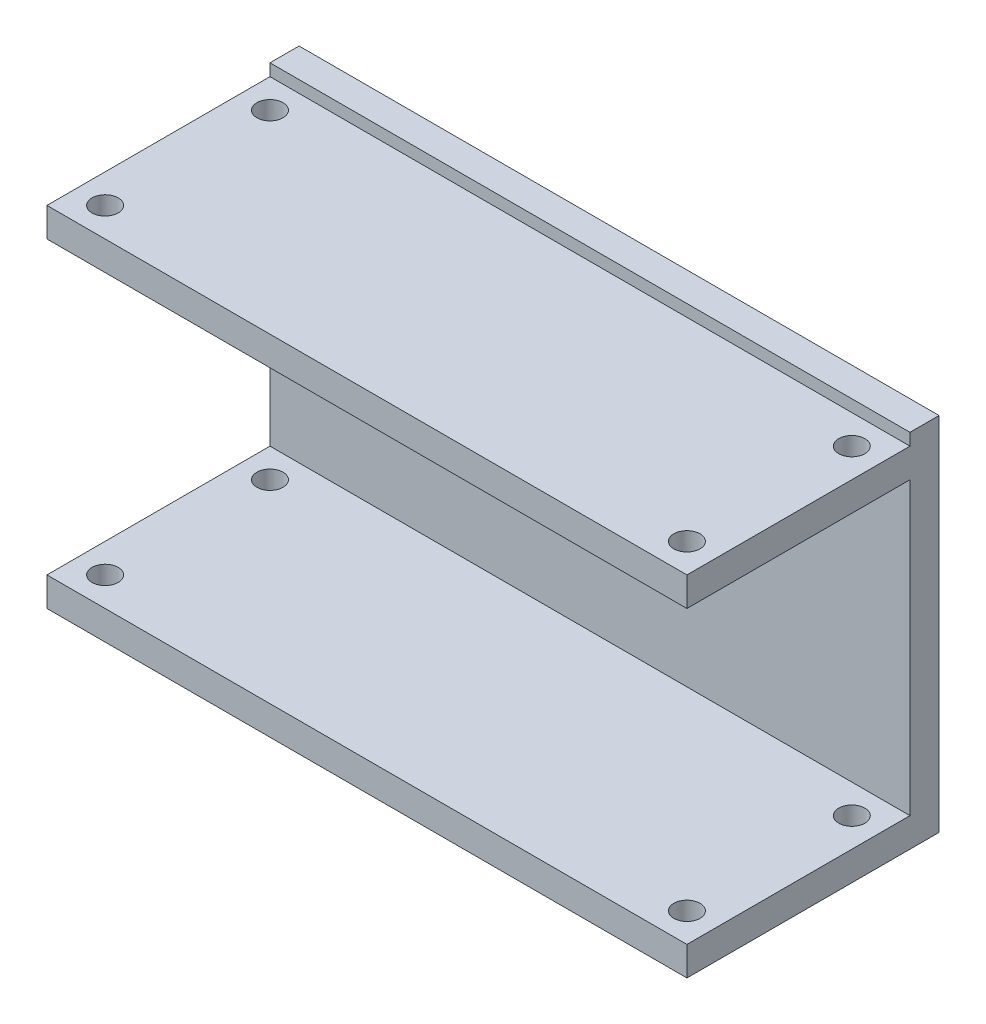
ISO-10303-21;
HEADER;
FILE_DESCRIPTION(('STEP AP214'),'2;1');
FILE_NAME('part.step','',(''),(''),'','','');
FILE_SCHEMA(('AUTOMOTIVE_DESIGN { 1 0 10303 214 1 1 1 1 }'));
ENDSEC;
DATA;
#1=APPLICATION_CONTEXT('core data for automotive mechanical design processes');
#2=APPLICATION_PROTOCOL_DEFINITION('international standard','automotive_design',2000,#1);
#3=PRODUCT_CONTEXT('',#1,'mechanical');
#4=PRODUCT('Part','Part','',(#3));
#5=PRODUCT_RELATED_PRODUCT_CATEGORY('part','',(#4));
#6=PRODUCT_DEFINITION_FORMATION('','',#4);
#7=PRODUCT_DEFINITION_CONTEXT('part definition',#1,'design');
#8=PRODUCT_DEFINITION('design','',#6,#7);
#9=PRODUCT_DEFINITION_SHAPE('','',#8);
#10=(LENGTH_UNIT() NAMED_UNIT(*) SI_UNIT(.MILLI.,.METRE.));
#11=(NAMED_UNIT(*) PLANE_ANGLE_UNIT() SI_UNIT($,.RADIAN.));
#12=(NAMED_UNIT(*) SI_UNIT($,.STERADIAN.) SOLID_ANGLE_UNIT());
#13=UNCERTAINTY_MEASURE_WITH_UNIT(LENGTH_MEASURE(1.E-05),#10,'distance_accuracy_value','');
#14=(GEOMETRIC_REPRESENTATION_CONTEXT(3) GLOBAL_UNCERTAINTY_ASSIGNED_CONTEXT((#13)) GLOBAL_UNIT_ASSIGNED_CONTEXT((#10,
#11,#12)) REPRESENTATION_CONTEXT('',''));
#15=CARTESIAN_POINT('',(0.,0.,0.));
#16=DIRECTION('',(0.,0.,1.));
#17=DIRECTION('',(1.,0.,0.));
#18=AXIS2_PLACEMENT_3D('',#15,#16,#17);
#19=CARTESIAN_POINT('',(0.,0.,-11.5));
#20=DIRECTION('',(0.,0.,1.));
#21=DIRECTION('',(1.,0.,0.));
#22=AXIS2_PLACEMENT_3D('',#19,#20,#21);
#23=PLANE('',#22);
#24=DIRECTION('',(0.,1.,0.));
#25=VECTOR('',#24,1.);
#26=CARTESIAN_POINT('',(-33.,0.,-11.5));
#27=LINE('',#26,#25);
#28=CARTESIAN_POINT('',(-33.,36.,-11.5));
#29=VERTEX_POINT('',#28);
#30=CARTESIAN_POINT('',(-33.,37.2364215365135,-11.5));
#31=VERTEX_POINT('',#30);
#32=EDGE_CURVE('E193',#29,#31,#27,.T.);
#33=ORIENTED_EDGE('',*,*,#32,.F.);
#34=DIRECTION('',(-1.,0.,0.));
#35=VECTOR('',#34,1.);
#36=CARTESIAN_POINT('',(-33.,36.,-11.5));
#37=LINE('',#36,#35);
#38=CARTESIAN_POINT('',(33.,36.,-11.5));
#39=VERTEX_POINT('',#38);
#40=EDGE_CURVE('E148',#39,#29,#37,.T.);
#41=ORIENTED_EDGE('',*,*,#40,.F.);
#42=DIRECTION('',(0.,-1.,0.));
#43=VECTOR('',#42,1.);
#44=CARTESIAN_POINT('',(33.,0.,-11.5));
#45=LINE('',#44,#43);
#46=CARTESIAN_POINT('',(33.,37.2364215365135,-11.5));
#47=VERTEX_POINT('',#46);
#48=EDGE_CURVE('E190',#47,#39,#45,.T.);
#49=ORIENTED_EDGE('',*,*,#48,.F.);
#50=DIRECTION('',(1.,0.,0.));
#51=VECTOR('',#50,1.);
#52=CARTESIAN_POINT('',(33.,37.2364215365135,-11.5));
#53=LINE('',#52,#51);
#54=EDGE_CURVE('E179',#31,#47,#53,.T.);
#55=ORIENTED_EDGE('',*,*,#54,.F.);
#56=EDGE_LOOP('',(#33,#41,#49,#55));
#57=FACE_BOUND('',#56,.T.);
#58=ADVANCED_FACE('F39',(#57),#23,.T.);
#59=CARTESIAN_POINT('',(0.,3.,0.));
#60=DIRECTION('',(0.,1.,0.));
#61=DIRECTION('',(0.,0.,1.));
#62=AXIS2_PLACEMENT_3D('',#59,#60,#61);
#63=PLANE('',#62);
#64=CARTESIAN_POINT('',(-30.,3.,8.5));
#65=DIRECTION('',(0.,1.,0.));
#66=DIRECTION('',(0.,0.,1.));
#67=AXIS2_PLACEMENT_3D('',#64,#65,#66);
#68=CIRCLE('',#67,1.35);
#69=CARTESIAN_POINT('',(-30.,3.,9.85));
#70=VERTEX_POINT('',#69);
#71=EDGE_CURVE('E214',#70,#70,#68,.T.);
#72=ORIENTED_EDGE('',*,*,#71,.F.);
#73=EDGE_LOOP('',(#72));
#74=FACE_BOUND('',#73,.T.);
#75=CARTESIAN_POINT('',(30.,3.,8.5));
#76=DIRECTION('',(0.,1.,0.));
#77=DIRECTION('',(0.,0.,-1.));
#78=AXIS2_PLACEMENT_3D('',#75,#76,#77);
#79=CIRCLE('',#78,1.35000000000001);
#80=CARTESIAN_POINT('',(30.,3.,7.15));
#81=VERTEX_POINT('',#80);
#82=EDGE_CURVE('E230',#81,#81,#79,.T.);
#83=ORIENTED_EDGE('',*,*,#82,.F.);
#84=EDGE_LOOP('',(#83));
#85=FACE_BOUND('',#84,.T.);
#86=DIRECTION('',(0.,0.,-1.));
#87=VECTOR('',#86,1.);
#88=CARTESIAN_POINT('',(33.,3.,-11.5));
#89=LINE('',#88,#87);
#90=CARTESIAN_POINT('',(33.,3.,11.5));
#91=VERTEX_POINT('',#90);
#92=CARTESIAN_POINT('',(33.,3.,-11.5));
#93=VERTEX_POINT('',#92);
#94=EDGE_CURVE('E238',#91,#93,#89,.T.);
#95=ORIENTED_EDGE('',*,*,#94,.T.);
#96=DIRECTION('',(-1.,0.,0.));
#97=VECTOR('',#96,1.);
#98=CARTESIAN_POINT('',(-33.,3.,-11.5));
#99=LINE('',#98,#97);
#100=CARTESIAN_POINT('',(-33.,3.,-11.5));
#101=VERTEX_POINT('',#100);
#102=EDGE_CURVE('E241',#93,#101,#99,.T.);
#103=ORIENTED_EDGE('',*,*,#102,.T.);
#104=DIRECTION('',(0.,0.,1.));
#105=VECTOR('',#104,1.);
#106=CARTESIAN_POINT('',(-33.,3.,-11.5));
#107=LINE('',#106,#105);
#108=CARTESIAN_POINT('',(-33.,3.,11.5));
#109=VERTEX_POINT('',#108);
#110=EDGE_CURVE('E244',#101,#109,#107,.T.);
#111=ORIENTED_EDGE('',*,*,#110,.T.);
#112=DIRECTION('',(1.,0.,0.));
#113=VECTOR('',#112,1.);
#114=CARTESIAN_POINT('',(-33.,3.,11.5));
#115=LINE('',#114,#113);
#116=EDGE_CURVE('E64',#109,#91,#115,.T.);
#117=ORIENTED_EDGE('',*,*,#116,.T.);
#118=EDGE_LOOP('',(#95,#103,#111,#117));
#119=FACE_BOUND('',#118,.T.);
#120=CARTESIAN_POINT('',(30.,3.,-8.5));
#121=DIRECTION('',(0.,1.,0.));
#122=DIRECTION('',(0.,0.,-1.));
#123=AXIS2_PLACEMENT_3D('',#120,#121,#122);
#124=CIRCLE('',#123,1.35000000000001);
#125=CARTESIAN_POINT('',(30.,3.,-9.85));
#126=VERTEX_POINT('',#125);
#127=EDGE_CURVE('E222',#126,#126,#124,.T.);
#128=ORIENTED_EDGE('',*,*,#127,.F.);
#129=EDGE_LOOP('',(#128));
#130=FACE_BOUND('',#129,.T.);
#131=CARTESIAN_POINT('',(-30.,3.,-8.5));
#132=DIRECTION('',(0.,1.,0.));
#133=DIRECTION('',(0.,0.,1.));
#134=AXIS2_PLACEMENT_3D('',#131,#132,#133);
#135=CIRCLE('',#134,1.35);
#136=CARTESIAN_POINT('',(-30.,3.,-7.15));
#137=VERTEX_POINT('',#136);
#138=EDGE_CURVE('E206',#137,#137,#135,.T.);
#139=ORIENTED_EDGE('',*,*,#138,.F.);
#140=EDGE_LOOP('',(#139));
#141=FACE_BOUND('',#140,.T.);
#142=ADVANCED_FACE('F281',(#74,#85,#119,#130,#141),#63,.T.);
#143=CARTESIAN_POINT('',(0.,0.,0.));
#144=DIRECTION('',(0.,1.,0.));
#145=DIRECTION('',(0.,0.,1.));
#146=AXIS2_PLACEMENT_3D('',#143,#144,#145);
#147=PLANE('',#146);
#148=DIRECTION('',(0.,0.,-1.));
#149=VECTOR('',#148,1.);
#150=CARTESIAN_POINT('',(33.,0.,-11.5));
#151=LINE('',#150,#149);
#152=CARTESIAN_POINT('',(33.,0.,11.5));
#153=VERTEX_POINT('',#152);
#154=CARTESIAN_POINT('',(33.,0.,-14.5));
#155=VERTEX_POINT('',#154);
#156=EDGE_CURVE('E234',#153,#155,#151,.T.);
#157=ORIENTED_EDGE('',*,*,#156,.F.);
#158=DIRECTION('',(1.,0.,0.));
#159=VECTOR('',#158,1.);
#160=CARTESIAN_POINT('',(-33.,0.,11.5));
#161=LINE('',#160,#159);
#162=CARTESIAN_POINT('',(-33.,0.,11.5));
#163=VERTEX_POINT('',#162);
#164=EDGE_CURVE('E77',#163,#153,#161,.T.);
#165=ORIENTED_EDGE('',*,*,#164,.F.);
#166=DIRECTION('',(0.,0.,1.));
#167=VECTOR('',#166,1.);
#168=CARTESIAN_POINT('',(-33.,0.,-11.5));
#169=LINE('',#168,#167);
#170=CARTESIAN_POINT('',(-33.,0.,-14.5));
#171=VERTEX_POINT('',#170);
#172=EDGE_CURVE('E251',#171,#163,#169,.T.);
#173=ORIENTED_EDGE('',*,*,#172,.F.);
#174=DIRECTION('',(-1.,0.,0.));
#175=VECTOR('',#174,1.);
#176=CARTESIAN_POINT('',(33.,0.,-14.5));
#177=LINE('',#176,#175);
#178=EDGE_CURVE('E178',#155,#171,#177,.T.);
#179=ORIENTED_EDGE('',*,*,#178,.F.);
#180=EDGE_LOOP('',(#157,#165,#173,#179));
#181=FACE_BOUND('',#180,.T.);
#182=CARTESIAN_POINT('',(30.,0.,8.5));
#183=DIRECTION('',(0.,1.,0.));
#184=DIRECTION('',(0.,0.,-1.));
#185=AXIS2_PLACEMENT_3D('',#182,#183,#184);
#186=CIRCLE('',#185,1.35000000000001);
#187=CARTESIAN_POINT('',(30.,0.,7.15));
#188=VERTEX_POINT('',#187);
#189=EDGE_CURVE('E226',#188,#188,#186,.T.);
#190=ORIENTED_EDGE('',*,*,#189,.T.);
#191=EDGE_LOOP('',(#190));
#192=FACE_BOUND('',#191,.T.);
#193=CARTESIAN_POINT('',(30.,0.,-8.5));
#194=DIRECTION('',(0.,1.,0.));
#195=DIRECTION('',(0.,0.,-1.));
#196=AXIS2_PLACEMENT_3D('',#193,#194,#195);
#197=CIRCLE('',#196,1.35000000000001);
#198=CARTESIAN_POINT('',(30.,0.,-9.85));
#199=VERTEX_POINT('',#198);
#200=EDGE_CURVE('E218',#199,#199,#197,.T.);
#201=ORIENTED_EDGE('',*,*,#200,.T.);
#202=EDGE_LOOP('',(#201));
#203=FACE_BOUND('',#202,.T.);
#204=CARTESIAN_POINT('',(-30.,0.,8.5));
#205=DIRECTION('',(0.,1.,0.));
#206=DIRECTION('',(0.,0.,1.));
#207=AXIS2_PLACEMENT_3D('',#204,#205,#206);
#208=CIRCLE('',#207,1.35);
#209=CARTESIAN_POINT('',(-30.,0.,9.85));
#210=VERTEX_POINT('',#209);
#211=EDGE_CURVE('E210',#210,#210,#208,.T.);
#212=ORIENTED_EDGE('',*,*,#211,.T.);
#213=EDGE_LOOP('',(#212));
#214=FACE_BOUND('',#213,.T.);
#215=CARTESIAN_POINT('',(-30.,0.,-8.5));
#216=DIRECTION('',(0.,1.,0.));
#217=DIRECTION('',(0.,0.,1.));
#218=AXIS2_PLACEMENT_3D('',#215,#216,#217);
#219=CIRCLE('',#218,1.35);
#220=CARTESIAN_POINT('',(-30.,0.,-7.15));
#221=VERTEX_POINT('',#220);
#222=EDGE_CURVE('E205',#221,#221,#219,.T.);
#223=ORIENTED_EDGE('',*,*,#222,.T.);
#224=EDGE_LOOP('',(#223));
#225=FACE_BOUND('',#224,.T.);
#226=ADVANCED_FACE('F261',(#181,#192,#203,#214,#225),#147,.F.);
#227=CARTESIAN_POINT('',(33.,3.,-11.5));
#228=DIRECTION('',(-1.,0.,0.));
#229=DIRECTION('',(0.,0.,1.));
#230=AXIS2_PLACEMENT_3D('',#227,#228,#229);
#231=PLANE('',#230);
#232=ORIENTED_EDGE('',*,*,#156,.T.);
#233=DIRECTION('',(0.,-1.,0.));
#234=VECTOR('',#233,1.);
#235=CARTESIAN_POINT('',(33.,0.,-14.5));
#236=LINE('',#235,#234);
#237=CARTESIAN_POINT('',(33.,37.2364215365135,-14.5));
#238=VERTEX_POINT('',#237);
#239=EDGE_CURVE('E174',#238,#155,#236,.T.);
#240=ORIENTED_EDGE('',*,*,#239,.F.);
#241=DIRECTION('',(0.,0.,1.));
#242=VECTOR('',#241,1.);
#243=CARTESIAN_POINT('',(33.,37.2364215365135,-14.5));
#244=LINE('',#243,#242);
#245=EDGE_CURVE('E189',#238,#47,#244,.T.);
#246=ORIENTED_EDGE('',*,*,#245,.T.);
#247=ORIENTED_EDGE('',*,*,#48,.T.);
#248=DIRECTION('',(0.,0.,-1.));
#249=VECTOR('',#248,1.);
#250=CARTESIAN_POINT('',(33.,36.,-11.5));
#251=LINE('',#250,#249);
#252=CARTESIAN_POINT('',(33.,36.,11.5));
#253=VERTEX_POINT('',#252);
#254=EDGE_CURVE('E55',#253,#39,#251,.T.);
#255=ORIENTED_EDGE('',*,*,#254,.F.);
#256=DIRECTION('',(0.,1.,0.));
#257=VECTOR('',#256,1.);
#258=CARTESIAN_POINT('',(33.,33.,11.5));
#259=LINE('',#258,#257);
#260=CARTESIAN_POINT('',(33.,33.,11.5));
#261=VERTEX_POINT('',#260);
#262=EDGE_CURVE('E128',#261,#253,#259,.T.);
#263=ORIENTED_EDGE('',*,*,#262,.F.);
#264=DIRECTION('',(0.,0.,-1.));
#265=VECTOR('',#264,1.);
#266=CARTESIAN_POINT('',(33.,33.,-11.5));
#267=LINE('',#266,#265);
#268=CARTESIAN_POINT('',(33.,33.,-11.5));
#269=VERTEX_POINT('',#268);
#270=EDGE_CURVE('E130',#261,#269,#267,.T.);
#271=ORIENTED_EDGE('',*,*,#270,.T.);
#272=EDGE_CURVE('E137',#269,#93,#45,.T.);
#273=ORIENTED_EDGE('',*,*,#272,.T.);
#274=ORIENTED_EDGE('',*,*,#94,.F.);
#275=DIRECTION('',(0.,-1.,0.));
#276=VECTOR('',#275,1.);
#277=CARTESIAN_POINT('',(33.,3.,11.5));
#278=LINE('',#277,#276);
#279=EDGE_CURVE('E48',#91,#153,#278,.T.);
#280=ORIENTED_EDGE('',*,*,#279,.T.);
#281=EDGE_LOOP('',(#232,#240,#246,#247,#255,#263,#271,#273,#274,#280));
#282=FACE_BOUND('',#281,.T.);
#283=ADVANCED_FACE('F41',(#282),#231,.F.);
#284=CARTESIAN_POINT('',(-33.,3.,-11.5));
#285=DIRECTION('',(1.,0.,0.));
#286=DIRECTION('',(0.,0.,-1.));
#287=AXIS2_PLACEMENT_3D('',#284,#285,#286);
#288=PLANE('',#287);
#289=ORIENTED_EDGE('',*,*,#172,.T.);
#290=DIRECTION('',(0.,-1.,0.));
#291=VECTOR('',#290,1.);
#292=CARTESIAN_POINT('',(-33.,3.,11.5));
#293=LINE('',#292,#291);
#294=EDGE_CURVE('E11',#109,#163,#293,.T.);
#295=ORIENTED_EDGE('',*,*,#294,.F.);
#296=ORIENTED_EDGE('',*,*,#110,.F.);
#297=CARTESIAN_POINT('',(-33.,33.,-11.5));
#298=VERTEX_POINT('',#297);
#299=EDGE_CURVE('E84',#101,#298,#27,.T.);
#300=ORIENTED_EDGE('',*,*,#299,.T.);
#301=DIRECTION('',(0.,0.,1.));
#302=VECTOR('',#301,1.);
#303=CARTESIAN_POINT('',(-33.,33.,-11.5));
#304=LINE('',#303,#302);
#305=CARTESIAN_POINT('',(-33.,33.,11.5));
#306=VERTEX_POINT('',#305);
#307=EDGE_CURVE('E152',#298,#306,#304,.T.);
#308=ORIENTED_EDGE('',*,*,#307,.T.);
#309=DIRECTION('',(0.,1.,0.));
#310=VECTOR('',#309,1.);
#311=CARTESIAN_POINT('',(-33.,33.,11.5));
#312=LINE('',#311,#310);
#313=CARTESIAN_POINT('',(-33.,36.,11.5));
#314=VERTEX_POINT('',#313);
#315=EDGE_CURVE('E138',#306,#314,#312,.T.);
#316=ORIENTED_EDGE('',*,*,#315,.T.);
#317=DIRECTION('',(0.,0.,1.));
#318=VECTOR('',#317,1.);
#319=CARTESIAN_POINT('',(-33.,36.,-11.5));
#320=LINE('',#319,#318);
#321=EDGE_CURVE('E166',#29,#314,#320,.T.);
#322=ORIENTED_EDGE('',*,*,#321,.F.);
#323=ORIENTED_EDGE('',*,*,#32,.T.);
#324=DIRECTION('',(0.,0.,1.));
#325=VECTOR('',#324,1.);
#326=CARTESIAN_POINT('',(-33.,37.2364215365135,-14.5));
#327=LINE('',#326,#325);
#328=CARTESIAN_POINT('',(-33.,37.2364215365135,-14.5));
#329=VERTEX_POINT('',#328);
#330=EDGE_CURVE('E201',#329,#31,#327,.T.);
#331=ORIENTED_EDGE('',*,*,#330,.F.);
#332=DIRECTION('',(0.,1.,0.));
#333=VECTOR('',#332,1.);
#334=CARTESIAN_POINT('',(-33.,0.,-14.5));
#335=LINE('',#334,#333);
#336=EDGE_CURVE('E183',#171,#329,#335,.T.);
#337=ORIENTED_EDGE('',*,*,#336,.F.);
#338=EDGE_LOOP('',(#289,#295,#296,#300,#308,#316,#322,#323,#331,#337));
#339=FACE_BOUND('',#338,.T.);
#340=ADVANCED_FACE('F275',(#339),#288,.F.);
#341=CARTESIAN_POINT('',(-33.,3.,11.5));
#342=DIRECTION('',(0.,0.,-1.));
#343=DIRECTION('',(-1.,0.,0.));
#344=AXIS2_PLACEMENT_3D('',#341,#342,#343);
#345=PLANE('',#344);
#346=ORIENTED_EDGE('',*,*,#164,.T.);
#347=ORIENTED_EDGE('',*,*,#279,.F.);
#348=ORIENTED_EDGE('',*,*,#116,.F.);
#349=ORIENTED_EDGE('',*,*,#294,.T.);
#350=EDGE_LOOP('',(#346,#347,#348,#349));
#351=FACE_BOUND('',#350,.T.);
#352=ADVANCED_FACE('F327',(#351),#345,.F.);
#353=CARTESIAN_POINT('',(30.,3.,8.5));
#354=DIRECTION('',(0.,-1.,0.));
#355=DIRECTION('',(0.,0.,-1.));
#356=AXIS2_PLACEMENT_3D('',#353,#354,#355);
#357=CYLINDRICAL_SURFACE('',#356,1.35000000000001);
#358=ORIENTED_EDGE('',*,*,#82,.T.);
#359=EDGE_LOOP('',(#358));
#360=FACE_BOUND('',#359,.T.);
#361=ORIENTED_EDGE('',*,*,#189,.F.);
#362=EDGE_LOOP('',(#361));
#363=FACE_BOUND('',#362,.T.);
#364=ADVANCED_FACE('F324',(#360,#363),#357,.F.);
#365=CARTESIAN_POINT('',(30.,3.,-8.5));
#366=DIRECTION('',(0.,-1.,0.));
#367=DIRECTION('',(0.,0.,-1.));
#368=AXIS2_PLACEMENT_3D('',#365,#366,#367);
#369=CYLINDRICAL_SURFACE('',#368,1.35000000000001);
#370=ORIENTED_EDGE('',*,*,#127,.T.);
#371=EDGE_LOOP('',(#370));
#372=FACE_BOUND('',#371,.T.);
#373=ORIENTED_EDGE('',*,*,#200,.F.);
#374=EDGE_LOOP('',(#373));
#375=FACE_BOUND('',#374,.T.);
#376=ADVANCED_FACE('F320',(#372,#375),#369,.F.);
#377=CARTESIAN_POINT('',(-30.,3.,8.5));
#378=DIRECTION('',(0.,-1.,0.));
#379=DIRECTION('',(0.,0.,-1.));
#380=AXIS2_PLACEMENT_3D('',#377,#378,#379);
#381=CYLINDRICAL_SURFACE('',#380,1.35);
#382=ORIENTED_EDGE('',*,*,#71,.T.);
#383=EDGE_LOOP('',(#382));
#384=FACE_BOUND('',#383,.T.);
#385=ORIENTED_EDGE('',*,*,#211,.F.);
#386=EDGE_LOOP('',(#385));
#387=FACE_BOUND('',#386,.T.);
#388=ADVANCED_FACE('F293',(#384,#387),#381,.F.);
#389=CARTESIAN_POINT('',(-30.,3.,-8.5));
#390=DIRECTION('',(0.,-1.,0.));
#391=DIRECTION('',(0.,0.,-1.));
#392=AXIS2_PLACEMENT_3D('',#389,#390,#391);
#393=CYLINDRICAL_SURFACE('',#392,1.35);
#394=ORIENTED_EDGE('',*,*,#138,.T.);
#395=EDGE_LOOP('',(#394));
#396=FACE_BOUND('',#395,.T.);
#397=ORIENTED_EDGE('',*,*,#222,.F.);
#398=EDGE_LOOP('',(#397));
#399=FACE_BOUND('',#398,.T.);
#400=ADVANCED_FACE('F290',(#396,#399),#393,.F.);
#401=DIRECTION('',(-1.,0.,0.));
#402=VECTOR('',#401,1.);
#403=CARTESIAN_POINT('',(-33.,33.,-11.5));
#404=LINE('',#403,#402);
#405=EDGE_CURVE('E145',#269,#298,#404,.T.);
#406=ORIENTED_EDGE('',*,*,#405,.T.);
#407=ORIENTED_EDGE('',*,*,#299,.F.);
#408=ORIENTED_EDGE('',*,*,#102,.F.);
#409=ORIENTED_EDGE('',*,*,#272,.F.);
#410=EDGE_LOOP('',(#406,#407,#408,#409));
#411=FACE_BOUND('',#410,.T.);
#412=ADVANCED_FACE('F278',(#411),#23,.T.);
#413=CARTESIAN_POINT('',(33.,37.2364215365135,-14.5));
#414=DIRECTION('',(0.,-1.,0.));
#415=DIRECTION('',(0.,0.,-1.));
#416=AXIS2_PLACEMENT_3D('',#413,#414,#415);
#417=PLANE('',#416);
#418=ORIENTED_EDGE('',*,*,#54,.T.);
#419=ORIENTED_EDGE('',*,*,#245,.F.);
#420=DIRECTION('',(1.,0.,0.));
#421=VECTOR('',#420,1.);
#422=CARTESIAN_POINT('',(33.,37.2364215365135,-14.5));
#423=LINE('',#422,#421);
#424=EDGE_CURVE('E186',#329,#238,#423,.T.);
#425=ORIENTED_EDGE('',*,*,#424,.F.);
#426=ORIENTED_EDGE('',*,*,#330,.T.);
#427=EDGE_LOOP('',(#418,#419,#425,#426));
#428=FACE_BOUND('',#427,.T.);
#429=ADVANCED_FACE('F310',(#428),#417,.F.);
#430=CARTESIAN_POINT('',(0.,0.,-14.5));
#431=DIRECTION('',(0.,0.,1.));
#432=DIRECTION('',(1.,0.,0.));
#433=AXIS2_PLACEMENT_3D('',#430,#431,#432);
#434=PLANE('',#433);
#435=ORIENTED_EDGE('',*,*,#239,.T.);
#436=ORIENTED_EDGE('',*,*,#178,.T.);
#437=ORIENTED_EDGE('',*,*,#336,.T.);
#438=ORIENTED_EDGE('',*,*,#424,.T.);
#439=EDGE_LOOP('',(#435,#436,#437,#438));
#440=FACE_BOUND('',#439,.T.);
#441=ADVANCED_FACE('F265',(#440),#434,.F.);
#442=CARTESIAN_POINT('',(-33.,33.,11.5));
#443=DIRECTION('',(0.,0.,1.));
#444=DIRECTION('',(1.,0.,0.));
#445=AXIS2_PLACEMENT_3D('',#442,#443,#444);
#446=PLANE('',#445);
#447=DIRECTION('',(1.,0.,0.));
#448=VECTOR('',#447,1.);
#449=CARTESIAN_POINT('',(-33.,36.,11.5));
#450=LINE('',#449,#448);
#451=EDGE_CURVE('E162',#314,#253,#450,.T.);
#452=ORIENTED_EDGE('',*,*,#451,.F.);
#453=ORIENTED_EDGE('',*,*,#315,.F.);
#454=DIRECTION('',(1.,0.,0.));
#455=VECTOR('',#454,1.);
#456=CARTESIAN_POINT('',(-33.,33.,11.5));
#457=LINE('',#456,#455);
#458=EDGE_CURVE('E143',#306,#261,#457,.T.);
#459=ORIENTED_EDGE('',*,*,#458,.T.);
#460=ORIENTED_EDGE('',*,*,#262,.T.);
#461=EDGE_LOOP('',(#452,#453,#459,#460));
#462=FACE_BOUND('',#461,.T.);
#463=ADVANCED_FACE('F150',(#462),#446,.T.);
#464=CARTESIAN_POINT('',(0.,33.,0.));
#465=DIRECTION('',(0.,-1.,0.));
#466=DIRECTION('',(0.,0.,1.));
#467=AXIS2_PLACEMENT_3D('',#464,#465,#466);
#468=PLANE('',#467);
#469=CARTESIAN_POINT('',(-30.,33.,-8.5));
#470=DIRECTION('',(0.,1.,0.));
#471=DIRECTION('',(0.,0.,1.));
#472=AXIS2_PLACEMENT_3D('',#469,#470,#471);
#473=CIRCLE('',#472,1.35);
#474=CARTESIAN_POINT('',(-30.,33.,-7.15));
#475=VERTEX_POINT('',#474);
#476=EDGE_CURVE('E495',#475,#475,#473,.T.);
#477=ORIENTED_EDGE('',*,*,#476,.T.);
#478=EDGE_LOOP('',(#477));
#479=FACE_BOUND('',#478,.T.);
#480=CARTESIAN_POINT('',(-30.,33.,8.5));
#481=DIRECTION('',(0.,1.,0.));
#482=DIRECTION('',(0.,0.,1.));
#483=AXIS2_PLACEMENT_3D('',#480,#481,#482);
#484=CIRCLE('',#483,1.35);
#485=CARTESIAN_POINT('',(-30.,33.,9.85));
#486=VERTEX_POINT('',#485);
#487=EDGE_CURVE('E505',#486,#486,#484,.T.);
#488=ORIENTED_EDGE('',*,*,#487,.T.);
#489=EDGE_LOOP('',(#488));
#490=FACE_BOUND('',#489,.T.);
#491=CARTESIAN_POINT('',(30.,33.,-8.5));
#492=DIRECTION('',(0.,1.,0.));
#493=DIRECTION('',(0.,0.,-1.));
#494=AXIS2_PLACEMENT_3D('',#491,#492,#493);
#495=CIRCLE('',#494,1.35000000000001);
#496=CARTESIAN_POINT('',(30.,33.,-9.85));
#497=VERTEX_POINT('',#496);
#498=EDGE_CURVE('E513',#497,#497,#495,.T.);
#499=ORIENTED_EDGE('',*,*,#498,.T.);
#500=EDGE_LOOP('',(#499));
#501=FACE_BOUND('',#500,.T.);
#502=CARTESIAN_POINT('',(30.,33.,8.5));
#503=DIRECTION('',(0.,1.,0.));
#504=DIRECTION('',(0.,0.,-1.));
#505=AXIS2_PLACEMENT_3D('',#502,#503,#504);
#506=CIRCLE('',#505,1.35000000000001);
#507=CARTESIAN_POINT('',(30.,33.,7.15));
#508=VERTEX_POINT('',#507);
#509=EDGE_CURVE('E163',#508,#508,#506,.T.);
#510=ORIENTED_EDGE('',*,*,#509,.T.);
#511=EDGE_LOOP('',(#510));
#512=FACE_BOUND('',#511,.T.);
#513=ORIENTED_EDGE('',*,*,#270,.F.);
#514=ORIENTED_EDGE('',*,*,#458,.F.);
#515=ORIENTED_EDGE('',*,*,#307,.F.);
#516=ORIENTED_EDGE('',*,*,#405,.F.);
#517=EDGE_LOOP('',(#513,#514,#515,#516));
#518=FACE_BOUND('',#517,.T.);
#519=ADVANCED_FACE('F142',(#479,#490,#501,#512,#518),#468,.T.);
#520=CARTESIAN_POINT('',(0.,36.,0.));
#521=DIRECTION('',(0.,-1.,0.));
#522=DIRECTION('',(0.,0.,1.));
#523=AXIS2_PLACEMENT_3D('',#520,#521,#522);
#524=PLANE('',#523);
#525=CARTESIAN_POINT('',(-30.,36.,-8.5));
#526=DIRECTION('',(0.,1.,0.));
#527=DIRECTION('',(0.,0.,1.));
#528=AXIS2_PLACEMENT_3D('',#525,#526,#527);
#529=CIRCLE('',#528,1.35);
#530=CARTESIAN_POINT('',(-30.,36.,-7.15));
#531=VERTEX_POINT('',#530);
#532=EDGE_CURVE('E498',#531,#531,#529,.T.);
#533=ORIENTED_EDGE('',*,*,#532,.F.);
#534=EDGE_LOOP('',(#533));
#535=FACE_BOUND('',#534,.T.);
#536=CARTESIAN_POINT('',(-30.,36.,8.5));
#537=DIRECTION('',(0.,1.,0.));
#538=DIRECTION('',(0.,0.,1.));
#539=AXIS2_PLACEMENT_3D('',#536,#537,#538);
#540=CIRCLE('',#539,1.35);
#541=CARTESIAN_POINT('',(-30.,36.,9.85));
#542=VERTEX_POINT('',#541);
#543=EDGE_CURVE('E502',#542,#542,#540,.T.);
#544=ORIENTED_EDGE('',*,*,#543,.F.);
#545=EDGE_LOOP('',(#544));
#546=FACE_BOUND('',#545,.T.);
#547=CARTESIAN_POINT('',(30.,36.,-8.5));
#548=DIRECTION('',(0.,1.,0.));
#549=DIRECTION('',(0.,0.,-1.));
#550=AXIS2_PLACEMENT_3D('',#547,#548,#549);
#551=CIRCLE('',#550,1.35000000000001);
#552=CARTESIAN_POINT('',(30.,36.,-9.85));
#553=VERTEX_POINT('',#552);
#554=EDGE_CURVE('E509',#553,#553,#551,.T.);
#555=ORIENTED_EDGE('',*,*,#554,.F.);
#556=EDGE_LOOP('',(#555));
#557=FACE_BOUND('',#556,.T.);
#558=CARTESIAN_POINT('',(30.,36.,8.5));
#559=DIRECTION('',(0.,1.,0.));
#560=DIRECTION('',(0.,0.,-1.));
#561=AXIS2_PLACEMENT_3D('',#558,#559,#560);
#562=CIRCLE('',#561,1.35000000000001);
#563=CARTESIAN_POINT('',(30.,36.,7.15));
#564=VERTEX_POINT('',#563);
#565=EDGE_CURVE('E517',#564,#564,#562,.T.);
#566=ORIENTED_EDGE('',*,*,#565,.F.);
#567=EDGE_LOOP('',(#566));
#568=FACE_BOUND('',#567,.T.);
#569=ORIENTED_EDGE('',*,*,#254,.T.);
#570=ORIENTED_EDGE('',*,*,#40,.T.);
#571=ORIENTED_EDGE('',*,*,#321,.T.);
#572=ORIENTED_EDGE('',*,*,#451,.T.);
#573=EDGE_LOOP('',(#569,#570,#571,#572));
#574=FACE_BOUND('',#573,.T.);
#575=ADVANCED_FACE('F273',(#535,#546,#557,#568,#574),#524,.F.);
#576=CARTESIAN_POINT('',(30.,33.,8.5));
#577=DIRECTION('',(0.,1.,0.));
#578=DIRECTION('',(0.,0.,1.));
#579=AXIS2_PLACEMENT_3D('',#576,#577,#578);
#580=CYLINDRICAL_SURFACE('',#579,1.35000000000001);
#581=ORIENTED_EDGE('',*,*,#509,.F.);
#582=EDGE_LOOP('',(#581));
#583=FACE_BOUND('',#582,.T.);
#584=ORIENTED_EDGE('',*,*,#565,.T.);
#585=EDGE_LOOP('',(#584));
#586=FACE_BOUND('',#585,.T.);
#587=ADVANCED_FACE('F448',(#583,#586),#580,.F.);
#588=CARTESIAN_POINT('',(30.,33.,-8.5));
#589=DIRECTION('',(0.,1.,0.));
#590=DIRECTION('',(0.,0.,1.));
#591=AXIS2_PLACEMENT_3D('',#588,#589,#590);
#592=CYLINDRICAL_SURFACE('',#591,1.35000000000001);
#593=ORIENTED_EDGE('',*,*,#498,.F.);
#594=EDGE_LOOP('',(#593));
#595=FACE_BOUND('',#594,.T.);
#596=ORIENTED_EDGE('',*,*,#554,.T.);
#597=EDGE_LOOP('',(#596));
#598=FACE_BOUND('',#597,.T.);
#599=ADVANCED_FACE('F458',(#595,#598),#592,.F.);
#600=CARTESIAN_POINT('',(-30.,33.,8.5));
#601=DIRECTION('',(0.,1.,0.));
#602=DIRECTION('',(0.,0.,1.));
#603=AXIS2_PLACEMENT_3D('',#600,#601,#602);
#604=CYLINDRICAL_SURFACE('',#603,1.35);
#605=ORIENTED_EDGE('',*,*,#487,.F.);
#606=EDGE_LOOP('',(#605));
#607=FACE_BOUND('',#606,.T.);
#608=ORIENTED_EDGE('',*,*,#543,.T.);
#609=EDGE_LOOP('',(#608));
#610=FACE_BOUND('',#609,.T.);
#611=ADVANCED_FACE('F468',(#607,#610),#604,.F.);
#612=CARTESIAN_POINT('',(-30.,33.,-8.5));
#613=DIRECTION('',(0.,1.,0.));
#614=DIRECTION('',(0.,0.,1.));
#615=AXIS2_PLACEMENT_3D('',#612,#613,#614);
#616=CYLINDRICAL_SURFACE('',#615,1.35);
#617=ORIENTED_EDGE('',*,*,#476,.F.);
#618=EDGE_LOOP('',(#617));
#619=FACE_BOUND('',#618,.T.);
#620=ORIENTED_EDGE('',*,*,#532,.T.);
#621=EDGE_LOOP('',(#620));
#622=FACE_BOUND('',#621,.T.);
#623=ADVANCED_FACE('F478',(#619,#622),#616,.F.);
#624=CLOSED_SHELL('',(#58,#142,#226,#283,#340,#352,#364,#376,#388,#400,#412,#429,#441,#463,#519,
#575,#587,#599,#611,#623));
#625=MANIFOLD_SOLID_BREP('B2',#624);
#626=ADVANCED_BREP_SHAPE_REPRESENTATION('',(#18,#625),#14);
#627=SHAPE_DEFINITION_REPRESENTATION(#9,#626);
ENDSEC;
END-ISO-10303-21;
